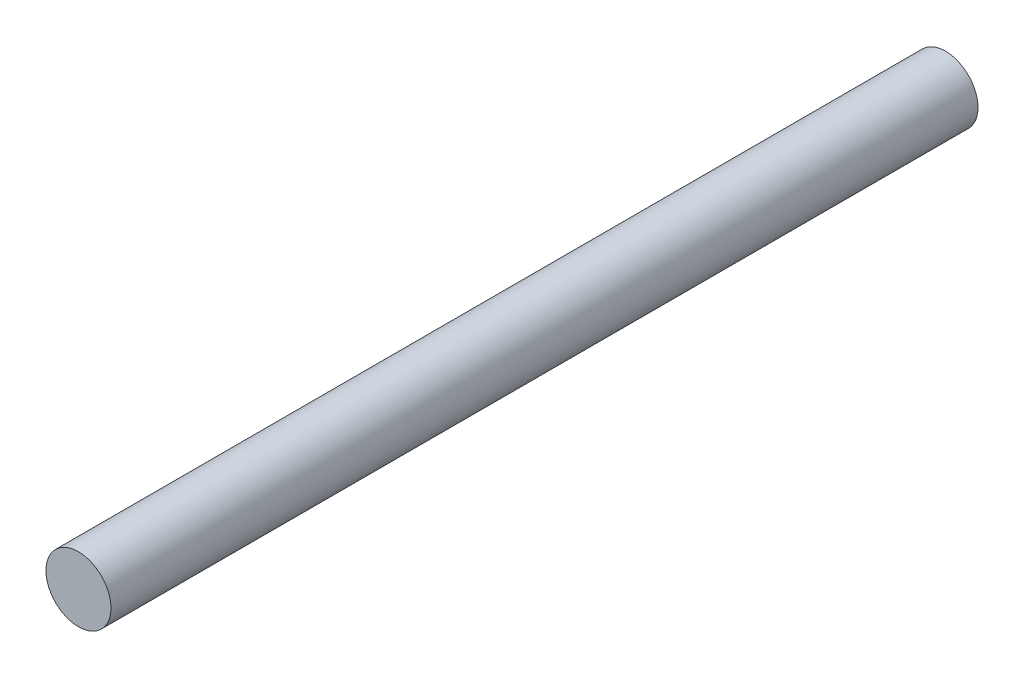
ISO-10303-21;
HEADER;
FILE_DESCRIPTION(('STEP AP214'),'2;1');
FILE_NAME('part.step','',(''),(''),'','','');
FILE_SCHEMA(('AUTOMOTIVE_DESIGN { 1 0 10303 214 1 1 1 1 }'));
ENDSEC;
DATA;
#1=APPLICATION_CONTEXT('core data for automotive mechanical design processes');
#2=APPLICATION_PROTOCOL_DEFINITION('international standard','automotive_design',2000,#1);
#3=PRODUCT_CONTEXT('',#1,'mechanical');
#4=PRODUCT('Part','Part','',(#3));
#5=PRODUCT_RELATED_PRODUCT_CATEGORY('part','',(#4));
#6=PRODUCT_DEFINITION_FORMATION('','',#4);
#7=PRODUCT_DEFINITION_CONTEXT('part definition',#1,'design');
#8=PRODUCT_DEFINITION('design','',#6,#7);
#9=PRODUCT_DEFINITION_SHAPE('','',#8);
#10=(LENGTH_UNIT() NAMED_UNIT(*) SI_UNIT(.MILLI.,.METRE.));
#11=(NAMED_UNIT(*) PLANE_ANGLE_UNIT() SI_UNIT($,.RADIAN.));
#12=(NAMED_UNIT(*) SI_UNIT($,.STERADIAN.) SOLID_ANGLE_UNIT());
#13=UNCERTAINTY_MEASURE_WITH_UNIT(LENGTH_MEASURE(1.E-05),#10,'distance_accuracy_value','');
#14=(GEOMETRIC_REPRESENTATION_CONTEXT(3) GLOBAL_UNCERTAINTY_ASSIGNED_CONTEXT((#13)) GLOBAL_UNIT_ASSIGNED_CONTEXT((#10,
#11,#12)) REPRESENTATION_CONTEXT('',''));
#15=CARTESIAN_POINT('',(0.,0.,0.));
#16=DIRECTION('',(0.,0.,1.));
#17=DIRECTION('',(1.,0.,0.));
#18=AXIS2_PLACEMENT_3D('',#15,#16,#17);
#19=CARTESIAN_POINT('',(0.,0.,100.));
#20=DIRECTION('',(0.,0.,-1.));
#21=DIRECTION('',(-1.,0.,0.));
#22=AXIS2_PLACEMENT_3D('',#19,#20,#21);
#23=CYLINDRICAL_SURFACE('',#22,3.75);
#24=CARTESIAN_POINT('',(0.,0.,100.));
#25=DIRECTION('',(0.,0.,1.));
#26=DIRECTION('',(1.,0.,0.));
#27=AXIS2_PLACEMENT_3D('',#24,#25,#26);
#28=CIRCLE('',#27,3.75);
#29=CARTESIAN_POINT('',(3.75,0.,100.));
#30=VERTEX_POINT('',#29);
#31=EDGE_CURVE('E10',#30,#30,#28,.T.);
#32=ORIENTED_EDGE('',*,*,#31,.F.);
#33=EDGE_LOOP('',(#32));
#34=FACE_BOUND('',#33,.T.);
#35=CARTESIAN_POINT('',(0.,0.,0.));
#36=DIRECTION('',(0.,0.,1.));
#37=DIRECTION('',(1.,0.,0.));
#38=AXIS2_PLACEMENT_3D('',#35,#36,#37);
#39=CIRCLE('',#38,3.75);
#40=CARTESIAN_POINT('',(3.75,0.,0.));
#41=VERTEX_POINT('',#40);
#42=EDGE_CURVE('E34',#41,#41,#39,.T.);
#43=ORIENTED_EDGE('',*,*,#42,.T.);
#44=EDGE_LOOP('',(#43));
#45=FACE_BOUND('',#44,.T.);
#46=ADVANCED_FACE('F31',(#34,#45),#23,.T.);
#47=CARTESIAN_POINT('',(0.,0.,100.));
#48=DIRECTION('',(0.,0.,1.));
#49=DIRECTION('',(1.,0.,0.));
#50=AXIS2_PLACEMENT_3D('',#47,#48,#49);
#51=PLANE('',#50);
#52=ORIENTED_EDGE('',*,*,#31,.T.);
#53=EDGE_LOOP('',(#52));
#54=FACE_BOUND('',#53,.T.);
#55=ADVANCED_FACE('F46',(#54),#51,.T.);
#56=CARTESIAN_POINT('',(0.,0.,0.));
#57=DIRECTION('',(0.,0.,1.));
#58=DIRECTION('',(1.,0.,0.));
#59=AXIS2_PLACEMENT_3D('',#56,#57,#58);
#60=PLANE('',#59);
#61=ORIENTED_EDGE('',*,*,#42,.F.);
#62=EDGE_LOOP('',(#61));
#63=FACE_BOUND('',#62,.T.);
#64=ADVANCED_FACE('F44',(#63),#60,.F.);
#65=CLOSED_SHELL('',(#46,#55,#64));
#66=MANIFOLD_SOLID_BREP('B2',#65);
#67=ADVANCED_BREP_SHAPE_REPRESENTATION('',(#18,#66),#14);
#68=SHAPE_DEFINITION_REPRESENTATION(#9,#67);
ENDSEC;
END-ISO-10303-21;
